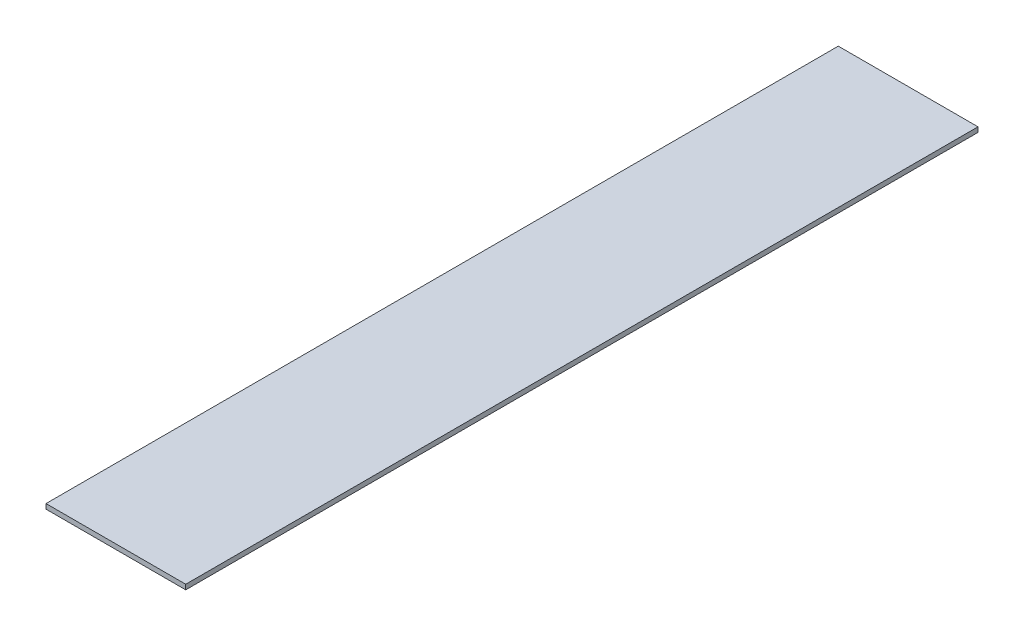
ISO-10303-21;
HEADER;
FILE_DESCRIPTION(('STEP AP214'),'2;1');
FILE_NAME('part.step','',(''),(''),'','','');
FILE_SCHEMA(('AUTOMOTIVE_DESIGN { 1 0 10303 214 1 1 1 1 }'));
ENDSEC;
DATA;
#1=APPLICATION_CONTEXT('core data for automotive mechanical design processes');
#2=APPLICATION_PROTOCOL_DEFINITION('international standard','automotive_design',2000,#1);
#3=PRODUCT_CONTEXT('',#1,'mechanical');
#4=PRODUCT('Part','Part','',(#3));
#5=PRODUCT_RELATED_PRODUCT_CATEGORY('part','',(#4));
#6=PRODUCT_DEFINITION_FORMATION('','',#4);
#7=PRODUCT_DEFINITION_CONTEXT('part definition',#1,'design');
#8=PRODUCT_DEFINITION('design','',#6,#7);
#9=PRODUCT_DEFINITION_SHAPE('','',#8);
#10=(LENGTH_UNIT() NAMED_UNIT(*) SI_UNIT(.MILLI.,.METRE.));
#11=(NAMED_UNIT(*) PLANE_ANGLE_UNIT() SI_UNIT($,.RADIAN.));
#12=(NAMED_UNIT(*) SI_UNIT($,.STERADIAN.) SOLID_ANGLE_UNIT());
#13=UNCERTAINTY_MEASURE_WITH_UNIT(LENGTH_MEASURE(1.E-05),#10,'distance_accuracy_value','');
#14=(GEOMETRIC_REPRESENTATION_CONTEXT(3) GLOBAL_UNCERTAINTY_ASSIGNED_CONTEXT((#13)) GLOBAL_UNIT_ASSIGNED_CONTEXT((#10,
#11,#12)) REPRESENTATION_CONTEXT('',''));
#15=CARTESIAN_POINT('',(0.,0.,0.));
#16=DIRECTION('',(0.,0.,1.));
#17=DIRECTION('',(1.,0.,0.));
#18=AXIS2_PLACEMENT_3D('',#15,#16,#17);
#19=CARTESIAN_POINT('',(-64.37,4.5,-365.));
#20=DIRECTION('',(1.,0.,0.));
#21=DIRECTION('',(0.,0.,-1.));
#22=AXIS2_PLACEMENT_3D('',#19,#20,#21);
#23=PLANE('',#22);
#24=DIRECTION('',(0.,0.,1.));
#25=VECTOR('',#24,1.);
#26=CARTESIAN_POINT('',(-64.37,0.,-365.));
#27=LINE('',#26,#25);
#28=CARTESIAN_POINT('',(-64.37,0.,-365.));
#29=VERTEX_POINT('',#28);
#30=CARTESIAN_POINT('',(-64.37,0.,365.));
#31=VERTEX_POINT('',#30);
#32=EDGE_CURVE('E107',#29,#31,#27,.T.);
#33=ORIENTED_EDGE('',*,*,#32,.T.);
#34=DIRECTION('',(0.,-1.,0.));
#35=VECTOR('',#34,1.);
#36=CARTESIAN_POINT('',(-64.37,4.5,365.));
#37=LINE('',#36,#35);
#38=CARTESIAN_POINT('',(-64.37,4.5,365.));
#39=VERTEX_POINT('',#38);
#40=EDGE_CURVE('E11',#39,#31,#37,.T.);
#41=ORIENTED_EDGE('',*,*,#40,.F.);
#42=DIRECTION('',(0.,0.,1.));
#43=VECTOR('',#42,1.);
#44=CARTESIAN_POINT('',(-64.37,4.5,-365.));
#45=LINE('',#44,#43);
#46=CARTESIAN_POINT('',(-64.37,4.5,-365.));
#47=VERTEX_POINT('',#46);
#48=EDGE_CURVE('E91',#47,#39,#45,.T.);
#49=ORIENTED_EDGE('',*,*,#48,.F.);
#50=DIRECTION('',(0.,-1.,0.));
#51=VECTOR('',#50,1.);
#52=CARTESIAN_POINT('',(-64.37,4.5,-365.));
#53=LINE('',#52,#51);
#54=EDGE_CURVE('E103',#47,#29,#53,.T.);
#55=ORIENTED_EDGE('',*,*,#54,.T.);
#56=EDGE_LOOP('',(#33,#41,#49,#55));
#57=FACE_BOUND('',#56,.T.);
#58=ADVANCED_FACE('F39',(#57),#23,.F.);
#59=CARTESIAN_POINT('',(-64.37,4.5,365.));
#60=DIRECTION('',(0.,0.,-1.));
#61=DIRECTION('',(-1.,0.,0.));
#62=AXIS2_PLACEMENT_3D('',#59,#60,#61);
#63=PLANE('',#62);
#64=DIRECTION('',(1.,0.,0.));
#65=VECTOR('',#64,1.);
#66=CARTESIAN_POINT('',(-64.37,0.,365.));
#67=LINE('',#66,#65);
#68=CARTESIAN_POINT('',(64.37,0.,365.));
#69=VERTEX_POINT('',#68);
#70=EDGE_CURVE('E96',#31,#69,#67,.T.);
#71=ORIENTED_EDGE('',*,*,#70,.T.);
#72=DIRECTION('',(0.,-1.,0.));
#73=VECTOR('',#72,1.);
#74=CARTESIAN_POINT('',(64.37,4.5,365.));
#75=LINE('',#74,#73);
#76=CARTESIAN_POINT('',(64.37,4.5,365.));
#77=VERTEX_POINT('',#76);
#78=EDGE_CURVE('E48',#77,#69,#75,.T.);
#79=ORIENTED_EDGE('',*,*,#78,.F.);
#80=DIRECTION('',(1.,0.,0.));
#81=VECTOR('',#80,1.);
#82=CARTESIAN_POINT('',(-64.37,4.5,365.));
#83=LINE('',#82,#81);
#84=EDGE_CURVE('E86',#39,#77,#83,.T.);
#85=ORIENTED_EDGE('',*,*,#84,.F.);
#86=ORIENTED_EDGE('',*,*,#40,.T.);
#87=EDGE_LOOP('',(#71,#79,#85,#86));
#88=FACE_BOUND('',#87,.T.);
#89=ADVANCED_FACE('F95',(#88),#63,.F.);
#90=CARTESIAN_POINT('',(64.37,4.5,-365.));
#91=DIRECTION('',(-1.,0.,0.));
#92=DIRECTION('',(0.,0.,1.));
#93=AXIS2_PLACEMENT_3D('',#90,#91,#92);
#94=PLANE('',#93);
#95=DIRECTION('',(0.,0.,-1.));
#96=VECTOR('',#95,1.);
#97=CARTESIAN_POINT('',(64.37,0.,-365.));
#98=LINE('',#97,#96);
#99=CARTESIAN_POINT('',(64.37,0.,-365.));
#100=VERTEX_POINT('',#99);
#101=EDGE_CURVE('E73',#69,#100,#98,.T.);
#102=ORIENTED_EDGE('',*,*,#101,.T.);
#103=DIRECTION('',(0.,-1.,0.));
#104=VECTOR('',#103,1.);
#105=CARTESIAN_POINT('',(64.37,4.5,-365.));
#106=LINE('',#105,#104);
#107=CARTESIAN_POINT('',(64.37,4.5,-365.));
#108=VERTEX_POINT('',#107);
#109=EDGE_CURVE('E98',#108,#100,#106,.T.);
#110=ORIENTED_EDGE('',*,*,#109,.F.);
#111=DIRECTION('',(0.,0.,-1.));
#112=VECTOR('',#111,1.);
#113=CARTESIAN_POINT('',(64.37,4.5,-365.));
#114=LINE('',#113,#112);
#115=EDGE_CURVE('E89',#77,#108,#114,.T.);
#116=ORIENTED_EDGE('',*,*,#115,.F.);
#117=ORIENTED_EDGE('',*,*,#78,.T.);
#118=EDGE_LOOP('',(#102,#110,#116,#117));
#119=FACE_BOUND('',#118,.T.);
#120=ADVANCED_FACE('F99',(#119),#94,.F.);
#121=CARTESIAN_POINT('',(-64.37,4.5,-365.));
#122=DIRECTION('',(0.,0.,1.));
#123=DIRECTION('',(1.,0.,0.));
#124=AXIS2_PLACEMENT_3D('',#121,#122,#123);
#125=PLANE('',#124);
#126=DIRECTION('',(-1.,0.,0.));
#127=VECTOR('',#126,1.);
#128=CARTESIAN_POINT('',(-64.37,0.,-365.));
#129=LINE('',#128,#127);
#130=EDGE_CURVE('E79',#100,#29,#129,.T.);
#131=ORIENTED_EDGE('',*,*,#130,.T.);
#132=ORIENTED_EDGE('',*,*,#54,.F.);
#133=DIRECTION('',(-1.,0.,0.));
#134=VECTOR('',#133,1.);
#135=CARTESIAN_POINT('',(-64.37,4.5,-365.));
#136=LINE('',#135,#134);
#137=EDGE_CURVE('E56',#108,#47,#136,.T.);
#138=ORIENTED_EDGE('',*,*,#137,.F.);
#139=ORIENTED_EDGE('',*,*,#109,.T.);
#140=EDGE_LOOP('',(#131,#132,#138,#139));
#141=FACE_BOUND('',#140,.T.);
#142=ADVANCED_FACE('F120',(#141),#125,.F.);
#143=CARTESIAN_POINT('',(0.,4.5,0.));
#144=DIRECTION('',(0.,1.,0.));
#145=DIRECTION('',(0.,0.,1.));
#146=AXIS2_PLACEMENT_3D('',#143,#144,#145);
#147=PLANE('',#146);
#148=ORIENTED_EDGE('',*,*,#48,.T.);
#149=ORIENTED_EDGE('',*,*,#84,.T.);
#150=ORIENTED_EDGE('',*,*,#115,.T.);
#151=ORIENTED_EDGE('',*,*,#137,.T.);
#152=EDGE_LOOP('',(#148,#149,#150,#151));
#153=FACE_BOUND('',#152,.T.);
#154=ADVANCED_FACE('F87',(#153),#147,.T.);
#155=CARTESIAN_POINT('',(0.,0.,0.));
#156=DIRECTION('',(0.,1.,0.));
#157=DIRECTION('',(0.,0.,1.));
#158=AXIS2_PLACEMENT_3D('',#155,#156,#157);
#159=PLANE('',#158);
#160=ORIENTED_EDGE('',*,*,#32,.F.);
#161=ORIENTED_EDGE('',*,*,#130,.F.);
#162=ORIENTED_EDGE('',*,*,#101,.F.);
#163=ORIENTED_EDGE('',*,*,#70,.F.);
#164=EDGE_LOOP('',(#160,#161,#162,#163));
#165=FACE_BOUND('',#164,.T.);
#166=ADVANCED_FACE('F123',(#165),#159,.F.);
#167=CLOSED_SHELL('',(#58,#89,#120,#142,#154,#166));
#168=MANIFOLD_SOLID_BREP('B2',#167);
#169=ADVANCED_BREP_SHAPE_REPRESENTATION('',(#18,#168),#14);
#170=SHAPE_DEFINITION_REPRESENTATION(#9,#169);
ENDSEC;
END-ISO-10303-21;
